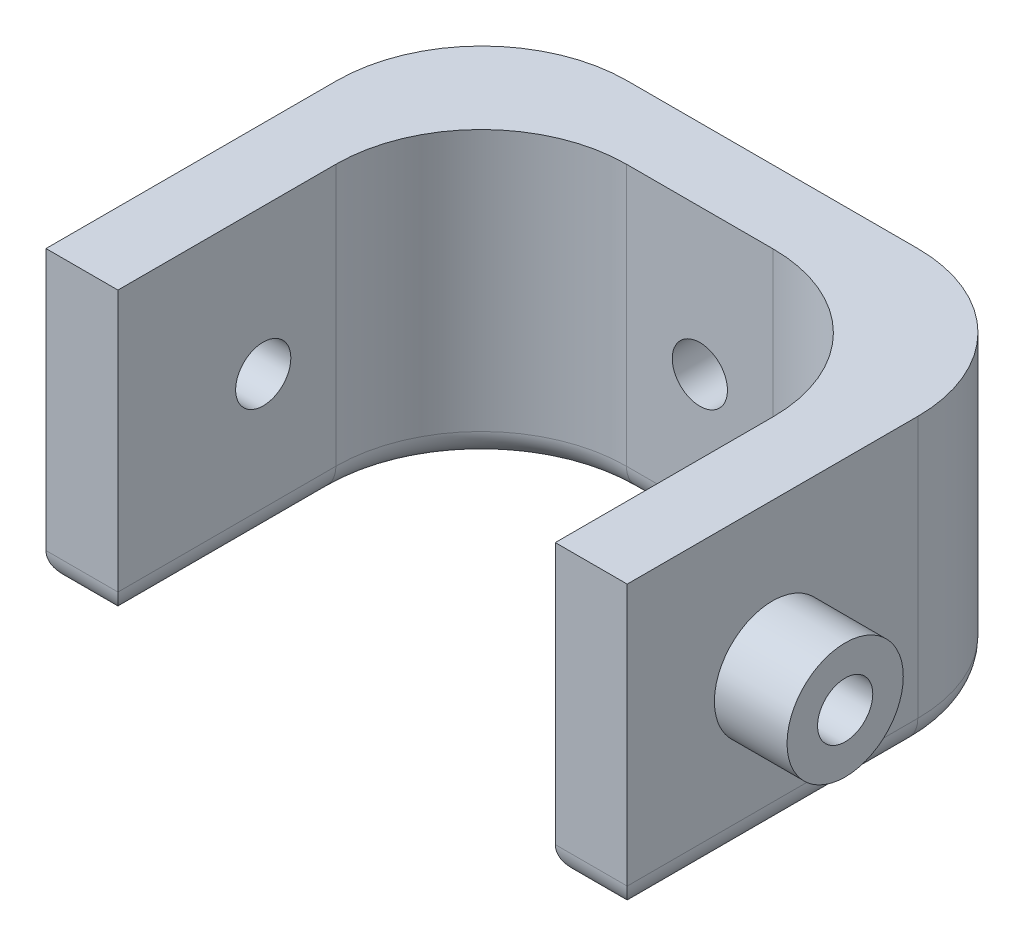
ISO-10303-21;
HEADER;
FILE_DESCRIPTION(('STEP AP214'),'2;1');
FILE_NAME('part.step','',(''),(''),'','','');
FILE_SCHEMA(('AUTOMOTIVE_DESIGN { 1 0 10303 214 1 1 1 1 }'));
ENDSEC;
DATA;
#1=APPLICATION_CONTEXT('core data for automotive mechanical design processes');
#2=APPLICATION_PROTOCOL_DEFINITION('international standard','automotive_design',2000,#1);
#3=PRODUCT_CONTEXT('',#1,'mechanical');
#4=PRODUCT('Part','Part','',(#3));
#5=PRODUCT_RELATED_PRODUCT_CATEGORY('part','',(#4));
#6=PRODUCT_DEFINITION_FORMATION('','',#4);
#7=PRODUCT_DEFINITION_CONTEXT('part definition',#1,'design');
#8=PRODUCT_DEFINITION('design','',#6,#7);
#9=PRODUCT_DEFINITION_SHAPE('','',#8);
#10=(LENGTH_UNIT() NAMED_UNIT(*) SI_UNIT(.MILLI.,.METRE.));
#11=(NAMED_UNIT(*) PLANE_ANGLE_UNIT() SI_UNIT($,.RADIAN.));
#12=(NAMED_UNIT(*) SI_UNIT($,.STERADIAN.) SOLID_ANGLE_UNIT());
#13=UNCERTAINTY_MEASURE_WITH_UNIT(LENGTH_MEASURE(1.E-05),#10,'distance_accuracy_value','');
#14=(GEOMETRIC_REPRESENTATION_CONTEXT(3) GLOBAL_UNCERTAINTY_ASSIGNED_CONTEXT((#13)) GLOBAL_UNIT_ASSIGNED_CONTEXT((#10,
#11,#12)) REPRESENTATION_CONTEXT('',''));
#15=CARTESIAN_POINT('',(0.,0.,0.));
#16=DIRECTION('',(0.,0.,1.));
#17=DIRECTION('',(1.,0.,0.));
#18=AXIS2_PLACEMENT_3D('',#15,#16,#17);
#19=CARTESIAN_POINT('',(-20.,20.,-15.));
#20=DIRECTION('',(1.,0.,0.));
#21=DIRECTION('',(0.,0.,-1.));
#22=AXIS2_PLACEMENT_3D('',#19,#20,#21);
#23=PLANE('',#22);
#24=CARTESIAN_POINT('',(-20.,10.,5.));
#25=DIRECTION('',(1.,0.,0.));
#26=DIRECTION('',(0.,0.,-1.));
#27=AXIS2_PLACEMENT_3D('',#24,#25,#26);
#28=CIRCLE('',#27,4.);
#29=CARTESIAN_POINT('',(-20.,10.,0.999999999999996));
#30=VERTEX_POINT('',#29);
#31=EDGE_CURVE('E475',#30,#30,#28,.T.);
#32=ORIENTED_EDGE('',*,*,#31,.T.);
#33=EDGE_LOOP('',(#32));
#34=FACE_BOUND('',#33,.T.);
#35=DIRECTION('',(0.,-1.,0.));
#36=VECTOR('',#35,1.);
#37=CARTESIAN_POINT('',(-20.,20.,-5.));
#38=LINE('',#37,#36);
#39=CARTESIAN_POINT('',(-20.,20.,-5.));
#40=VERTEX_POINT('',#39);
#41=CARTESIAN_POINT('',(-20.,2.,-5.));
#42=VERTEX_POINT('',#41);
#43=EDGE_CURVE('E188',#40,#42,#38,.T.);
#44=ORIENTED_EDGE('',*,*,#43,.T.);
#45=DIRECTION('',(0.,0.,1.));
#46=VECTOR('',#45,1.);
#47=CARTESIAN_POINT('',(-20.,2.,-15.));
#48=LINE('',#47,#46);
#49=CARTESIAN_POINT('',(-20.,2.,15.));
#50=VERTEX_POINT('',#49);
#51=EDGE_CURVE('E11',#42,#50,#48,.T.);
#52=ORIENTED_EDGE('',*,*,#51,.T.);
#53=DIRECTION('',(0.,-1.,0.));
#54=VECTOR('',#53,1.);
#55=CARTESIAN_POINT('',(-20.,20.,15.));
#56=LINE('',#55,#54);
#57=CARTESIAN_POINT('',(-20.,20.,15.));
#58=VERTEX_POINT('',#57);
#59=EDGE_CURVE('E180',#58,#50,#56,.T.);
#60=ORIENTED_EDGE('',*,*,#59,.F.);
#61=DIRECTION('',(0.,0.,1.));
#62=VECTOR('',#61,1.);
#63=CARTESIAN_POINT('',(-20.,20.,-15.));
#64=LINE('',#63,#62);
#65=EDGE_CURVE('E163',#40,#58,#64,.T.);
#66=ORIENTED_EDGE('',*,*,#65,.F.);
#67=EDGE_LOOP('',(#44,#52,#60,#66));
#68=FACE_BOUND('',#67,.T.);
#69=ADVANCED_FACE('F37',(#34,#68),#23,.F.);
#70=CARTESIAN_POINT('',(-20.,20.,15.));
#71=DIRECTION('',(0.,0.,-1.));
#72=DIRECTION('',(-1.,0.,0.));
#73=AXIS2_PLACEMENT_3D('',#70,#71,#72);
#74=PLANE('',#73);
#75=ORIENTED_EDGE('',*,*,#59,.T.);
#76=DIRECTION('',(1.,0.,0.));
#77=VECTOR('',#76,1.);
#78=CARTESIAN_POINT('',(-20.,2.,15.));
#79=LINE('',#78,#77);
#80=CARTESIAN_POINT('',(-15.05,2.,15.));
#81=VERTEX_POINT('',#80);
#82=EDGE_CURVE('E224',#50,#81,#79,.T.);
#83=ORIENTED_EDGE('',*,*,#82,.T.);
#84=DIRECTION('',(0.,-1.,0.));
#85=VECTOR('',#84,1.);
#86=CARTESIAN_POINT('',(-15.05,20.,15.));
#87=LINE('',#86,#85);
#88=CARTESIAN_POINT('',(-15.05,20.,15.));
#89=VERTEX_POINT('',#88);
#90=EDGE_CURVE('E183',#89,#81,#87,.T.);
#91=ORIENTED_EDGE('',*,*,#90,.F.);
#92=DIRECTION('',(1.,0.,0.));
#93=VECTOR('',#92,1.);
#94=CARTESIAN_POINT('',(-20.,20.,15.));
#95=LINE('',#94,#93);
#96=EDGE_CURVE('E168',#58,#89,#95,.T.);
#97=ORIENTED_EDGE('',*,*,#96,.F.);
#98=EDGE_LOOP('',(#75,#83,#91,#97));
#99=FACE_BOUND('',#98,.T.);
#100=ADVANCED_FACE('F178',(#99),#74,.F.);
#101=CARTESIAN_POINT('',(-15.05,20.,15.));
#102=DIRECTION('',(-1.,0.,0.));
#103=DIRECTION('',(0.,0.,1.));
#104=AXIS2_PLACEMENT_3D('',#101,#102,#103);
#105=PLANE('',#104);
#106=CARTESIAN_POINT('',(-15.05,10.,5.));
#107=DIRECTION('',(-1.,0.,0.));
#108=DIRECTION('',(0.,0.,1.));
#109=AXIS2_PLACEMENT_3D('',#106,#107,#108);
#110=CIRCLE('',#109,1.9);
#111=CARTESIAN_POINT('',(-15.05,10.,6.9));
#112=VERTEX_POINT('',#111);
#113=EDGE_CURVE('E469',#112,#112,#110,.T.);
#114=ORIENTED_EDGE('',*,*,#113,.T.);
#115=EDGE_LOOP('',(#114));
#116=FACE_BOUND('',#115,.T.);
#117=ORIENTED_EDGE('',*,*,#90,.T.);
#118=DIRECTION('',(0.,0.,-1.));
#119=VECTOR('',#118,1.);
#120=CARTESIAN_POINT('',(-15.05,2.,15.));
#121=LINE('',#120,#119);
#122=CARTESIAN_POINT('',(-15.05,2.,0.));
#123=VERTEX_POINT('',#122);
#124=EDGE_CURVE('E255',#81,#123,#121,.T.);
#125=ORIENTED_EDGE('',*,*,#124,.T.);
#126=DIRECTION('',(0.,-1.,0.));
#127=VECTOR('',#126,1.);
#128=CARTESIAN_POINT('',(-15.05,20.,0.));
#129=LINE('',#128,#127);
#130=CARTESIAN_POINT('',(-15.05,20.,0.));
#131=VERTEX_POINT('',#130);
#132=EDGE_CURVE('E212',#123,#131,#129,.F.);
#133=ORIENTED_EDGE('',*,*,#132,.T.);
#134=DIRECTION('',(0.,0.,-1.));
#135=VECTOR('',#134,1.);
#136=CARTESIAN_POINT('',(-15.05,20.,15.));
#137=LINE('',#136,#135);
#138=EDGE_CURVE('E185',#89,#131,#137,.T.);
#139=ORIENTED_EDGE('',*,*,#138,.F.);
#140=EDGE_LOOP('',(#117,#125,#133,#139));
#141=FACE_BOUND('',#140,.T.);
#142=ADVANCED_FACE('F342',(#116,#141),#105,.F.);
#143=CARTESIAN_POINT('',(-15.05,20.,-10.));
#144=DIRECTION('',(0.,0.,-1.));
#145=DIRECTION('',(-1.,0.,0.));
#146=AXIS2_PLACEMENT_3D('',#143,#144,#145);
#147=PLANE('',#146);
#148=CARTESIAN_POINT('',(0.,10.,-10.));
#149=DIRECTION('',(0.,0.,-1.));
#150=DIRECTION('',(-1.,0.,0.));
#151=AXIS2_PLACEMENT_3D('',#148,#149,#150);
#152=CIRCLE('',#151,1.9);
#153=CARTESIAN_POINT('',(-1.9,10.,-10.));
#154=VERTEX_POINT('',#153);
#155=EDGE_CURVE('E225',#154,#154,#152,.T.);
#156=ORIENTED_EDGE('',*,*,#155,.T.);
#157=EDGE_LOOP('',(#156));
#158=FACE_BOUND('',#157,.T.);
#159=DIRECTION('',(0.,-1.,0.));
#160=VECTOR('',#159,1.);
#161=CARTESIAN_POINT('',(-5.05,0.,-10.));
#162=LINE('',#161,#160);
#163=CARTESIAN_POINT('',(-5.05,20.,-10.));
#164=VERTEX_POINT('',#163);
#165=CARTESIAN_POINT('',(-5.05,2.,-10.));
#166=VERTEX_POINT('',#165);
#167=EDGE_CURVE('E207',#164,#166,#162,.T.);
#168=ORIENTED_EDGE('',*,*,#167,.T.);
#169=DIRECTION('',(1.,0.,0.));
#170=VECTOR('',#169,1.);
#171=CARTESIAN_POINT('',(-15.05,2.,-10.));
#172=LINE('',#171,#170);
#173=CARTESIAN_POINT('',(5.05000000000001,2.,-10.));
#174=VERTEX_POINT('',#173);
#175=EDGE_CURVE('E259',#166,#174,#172,.T.);
#176=ORIENTED_EDGE('',*,*,#175,.T.);
#177=DIRECTION('',(0.,-1.,0.));
#178=VECTOR('',#177,1.);
#179=CARTESIAN_POINT('',(5.05000000000001,20.,-10.));
#180=LINE('',#179,#178);
#181=CARTESIAN_POINT('',(5.05000000000001,20.,-10.));
#182=VERTEX_POINT('',#181);
#183=EDGE_CURVE('E210',#174,#182,#180,.F.);
#184=ORIENTED_EDGE('',*,*,#183,.T.);
#185=DIRECTION('',(1.,0.,0.));
#186=VECTOR('',#185,1.);
#187=CARTESIAN_POINT('',(-15.05,20.,-10.));
#188=LINE('',#187,#186);
#189=EDGE_CURVE('E345',#164,#182,#188,.T.);
#190=ORIENTED_EDGE('',*,*,#189,.F.);
#191=EDGE_LOOP('',(#168,#176,#184,#190));
#192=FACE_BOUND('',#191,.T.);
#193=ADVANCED_FACE('F433',(#158,#192),#147,.F.);
#194=CARTESIAN_POINT('',(15.05,20.,15.));
#195=DIRECTION('',(1.,0.,0.));
#196=DIRECTION('',(0.,0.,-1.));
#197=AXIS2_PLACEMENT_3D('',#194,#195,#196);
#198=PLANE('',#197);
#199=CARTESIAN_POINT('',(15.05,10.,5.));
#200=DIRECTION('',(1.,0.,0.));
#201=DIRECTION('',(0.,0.,-1.));
#202=AXIS2_PLACEMENT_3D('',#199,#200,#201);
#203=CIRCLE('',#202,1.9);
#204=CARTESIAN_POINT('',(15.05,10.,3.1));
#205=VERTEX_POINT('',#204);
#206=EDGE_CURVE('E472',#205,#205,#203,.T.);
#207=ORIENTED_EDGE('',*,*,#206,.T.);
#208=EDGE_LOOP('',(#207));
#209=FACE_BOUND('',#208,.T.);
#210=DIRECTION('',(0.,-1.,0.));
#211=VECTOR('',#210,1.);
#212=CARTESIAN_POINT('',(15.05,0.,0.));
#213=LINE('',#212,#211);
#214=CARTESIAN_POINT('',(15.05,20.,0.));
#215=VERTEX_POINT('',#214);
#216=CARTESIAN_POINT('',(15.05,2.,0.));
#217=VERTEX_POINT('',#216);
#218=EDGE_CURVE('E204',#215,#217,#213,.T.);
#219=ORIENTED_EDGE('',*,*,#218,.T.);
#220=DIRECTION('',(0.,0.,1.));
#221=VECTOR('',#220,1.);
#222=CARTESIAN_POINT('',(15.05,2.,15.));
#223=LINE('',#222,#221);
#224=CARTESIAN_POINT('',(15.05,2.,15.));
#225=VERTEX_POINT('',#224);
#226=EDGE_CURVE('E263',#217,#225,#223,.T.);
#227=ORIENTED_EDGE('',*,*,#226,.T.);
#228=DIRECTION('',(0.,-1.,0.));
#229=VECTOR('',#228,1.);
#230=CARTESIAN_POINT('',(15.05,20.,15.));
#231=LINE('',#230,#229);
#232=CARTESIAN_POINT('',(15.05,20.,15.));
#233=VERTEX_POINT('',#232);
#234=EDGE_CURVE('E192',#233,#225,#231,.T.);
#235=ORIENTED_EDGE('',*,*,#234,.F.);
#236=DIRECTION('',(0.,0.,1.));
#237=VECTOR('',#236,1.);
#238=CARTESIAN_POINT('',(15.05,20.,15.));
#239=LINE('',#238,#237);
#240=EDGE_CURVE('E348',#215,#233,#239,.T.);
#241=ORIENTED_EDGE('',*,*,#240,.F.);
#242=EDGE_LOOP('',(#219,#227,#235,#241));
#243=FACE_BOUND('',#242,.T.);
#244=ADVANCED_FACE('F369',(#209,#243),#198,.F.);
#245=CARTESIAN_POINT('',(15.05,20.,15.));
#246=DIRECTION('',(0.,0.,-1.));
#247=DIRECTION('',(-1.,0.,0.));
#248=AXIS2_PLACEMENT_3D('',#245,#246,#247);
#249=PLANE('',#248);
#250=ORIENTED_EDGE('',*,*,#234,.T.);
#251=DIRECTION('',(1.,0.,0.));
#252=VECTOR('',#251,1.);
#253=CARTESIAN_POINT('',(15.05,2.,15.));
#254=LINE('',#253,#252);
#255=CARTESIAN_POINT('',(20.,2.,15.));
#256=VERTEX_POINT('',#255);
#257=EDGE_CURVE('E265',#225,#256,#254,.T.);
#258=ORIENTED_EDGE('',*,*,#257,.T.);
#259=DIRECTION('',(0.,-1.,0.));
#260=VECTOR('',#259,1.);
#261=CARTESIAN_POINT('',(20.,20.,15.));
#262=LINE('',#261,#260);
#263=CARTESIAN_POINT('',(20.,20.,15.));
#264=VERTEX_POINT('',#263);
#265=EDGE_CURVE('E359',#264,#256,#262,.T.);
#266=ORIENTED_EDGE('',*,*,#265,.F.);
#267=DIRECTION('',(1.,0.,0.));
#268=VECTOR('',#267,1.);
#269=CARTESIAN_POINT('',(15.05,20.,15.));
#270=LINE('',#269,#268);
#271=EDGE_CURVE('E352',#233,#264,#270,.T.);
#272=ORIENTED_EDGE('',*,*,#271,.F.);
#273=EDGE_LOOP('',(#250,#258,#266,#272));
#274=FACE_BOUND('',#273,.T.);
#275=ADVANCED_FACE('F365',(#274),#249,.F.);
#276=CARTESIAN_POINT('',(20.,20.,-15.));
#277=DIRECTION('',(-1.,0.,0.));
#278=DIRECTION('',(0.,0.,1.));
#279=AXIS2_PLACEMENT_3D('',#276,#277,#278);
#280=PLANE('',#279);
#281=CARTESIAN_POINT('',(20.,10.,5.));
#282=DIRECTION('',(-1.,0.,0.));
#283=DIRECTION('',(0.,0.,1.));
#284=AXIS2_PLACEMENT_3D('',#281,#282,#283);
#285=CIRCLE('',#284,4.);
#286=CARTESIAN_POINT('',(20.,10.,9.));
#287=VERTEX_POINT('',#286);
#288=EDGE_CURVE('E218',#287,#287,#285,.F.);
#289=ORIENTED_EDGE('',*,*,#288,.F.);
#290=EDGE_LOOP('',(#289));
#291=FACE_BOUND('',#290,.T.);
#292=ORIENTED_EDGE('',*,*,#265,.T.);
#293=DIRECTION('',(0.,0.,-1.));
#294=VECTOR('',#293,1.);
#295=CARTESIAN_POINT('',(20.,2.,-15.));
#296=LINE('',#295,#294);
#297=CARTESIAN_POINT('',(20.,2.,-5.));
#298=VERTEX_POINT('',#297);
#299=EDGE_CURVE('E267',#256,#298,#296,.T.);
#300=ORIENTED_EDGE('',*,*,#299,.T.);
#301=DIRECTION('',(0.,-1.,0.));
#302=VECTOR('',#301,1.);
#303=CARTESIAN_POINT('',(20.,20.,-5.));
#304=LINE('',#303,#302);
#305=CARTESIAN_POINT('',(20.,20.,-5.));
#306=VERTEX_POINT('',#305);
#307=EDGE_CURVE('E202',#298,#306,#304,.F.);
#308=ORIENTED_EDGE('',*,*,#307,.T.);
#309=DIRECTION('',(0.,0.,-1.));
#310=VECTOR('',#309,1.);
#311=CARTESIAN_POINT('',(20.,20.,-15.));
#312=LINE('',#311,#310);
#313=EDGE_CURVE('E354',#264,#306,#312,.T.);
#314=ORIENTED_EDGE('',*,*,#313,.F.);
#315=EDGE_LOOP('',(#292,#300,#308,#314));
#316=FACE_BOUND('',#315,.T.);
#317=ADVANCED_FACE('F438',(#291,#316),#280,.F.);
#318=CARTESIAN_POINT('',(-20.,20.,-15.));
#319=DIRECTION('',(0.,0.,1.));
#320=DIRECTION('',(1.,0.,0.));
#321=AXIS2_PLACEMENT_3D('',#318,#319,#320);
#322=PLANE('',#321);
#323=CARTESIAN_POINT('',(0.,10.,-15.));
#324=DIRECTION('',(0.,0.,1.));
#325=DIRECTION('',(1.,0.,0.));
#326=AXIS2_PLACEMENT_3D('',#323,#324,#325);
#327=CIRCLE('',#326,4.);
#328=CARTESIAN_POINT('',(4.,10.,-15.));
#329=VERTEX_POINT('',#328);
#330=EDGE_CURVE('E221',#329,#329,#327,.F.);
#331=ORIENTED_EDGE('',*,*,#330,.F.);
#332=EDGE_LOOP('',(#331));
#333=FACE_BOUND('',#332,.T.);
#334=DIRECTION('',(0.,-1.,0.));
#335=VECTOR('',#334,1.);
#336=CARTESIAN_POINT('',(10.,20.,-15.));
#337=LINE('',#336,#335);
#338=CARTESIAN_POINT('',(10.,20.,-15.));
#339=VERTEX_POINT('',#338);
#340=CARTESIAN_POINT('',(10.,2.,-15.));
#341=VERTEX_POINT('',#340);
#342=EDGE_CURVE('E190',#339,#341,#337,.T.);
#343=ORIENTED_EDGE('',*,*,#342,.T.);
#344=DIRECTION('',(-1.,0.,0.));
#345=VECTOR('',#344,1.);
#346=CARTESIAN_POINT('',(-20.,2.,-15.));
#347=LINE('',#346,#345);
#348=CARTESIAN_POINT('',(-10.,2.,-15.));
#349=VERTEX_POINT('',#348);
#350=EDGE_CURVE('E61',#341,#349,#347,.T.);
#351=ORIENTED_EDGE('',*,*,#350,.T.);
#352=DIRECTION('',(0.,-1.,0.));
#353=VECTOR('',#352,1.);
#354=CARTESIAN_POINT('',(-10.,20.,-15.));
#355=LINE('',#354,#353);
#356=CARTESIAN_POINT('',(-10.,20.,-15.));
#357=VERTEX_POINT('',#356);
#358=EDGE_CURVE('E197',#349,#357,#355,.F.);
#359=ORIENTED_EDGE('',*,*,#358,.T.);
#360=DIRECTION('',(-1.,0.,0.));
#361=VECTOR('',#360,1.);
#362=CARTESIAN_POINT('',(-20.,20.,-15.));
#363=LINE('',#362,#361);
#364=EDGE_CURVE('E357',#339,#357,#363,.T.);
#365=ORIENTED_EDGE('',*,*,#364,.F.);
#366=EDGE_LOOP('',(#343,#351,#359,#365));
#367=FACE_BOUND('',#366,.T.);
#368=ADVANCED_FACE('F442',(#333,#367),#322,.F.);
#369=CARTESIAN_POINT('',(0.,20.,0.));
#370=DIRECTION('',(0.,1.,0.));
#371=DIRECTION('',(0.,0.,1.));
#372=AXIS2_PLACEMENT_3D('',#369,#370,#371);
#373=PLANE('',#372);
#374=ORIENTED_EDGE('',*,*,#364,.T.);
#375=CARTESIAN_POINT('',(-9.99999999999999,20.,-5.));
#376=DIRECTION('',(0.,1.,0.));
#377=DIRECTION('',(0.,0.,1.));
#378=AXIS2_PLACEMENT_3D('',#375,#376,#377);
#379=CIRCLE('',#378,10.);
#380=EDGE_CURVE('E171',#357,#40,#379,.T.);
#381=ORIENTED_EDGE('',*,*,#380,.T.);
#382=ORIENTED_EDGE('',*,*,#65,.T.);
#383=ORIENTED_EDGE('',*,*,#96,.T.);
#384=ORIENTED_EDGE('',*,*,#138,.T.);
#385=CARTESIAN_POINT('',(-5.05,20.,0.));
#386=DIRECTION('',(0.,1.,0.));
#387=DIRECTION('',(0.,0.,1.));
#388=AXIS2_PLACEMENT_3D('',#385,#386,#387);
#389=CIRCLE('',#388,10.);
#390=EDGE_CURVE('E216',#131,#164,#389,.F.);
#391=ORIENTED_EDGE('',*,*,#390,.T.);
#392=ORIENTED_EDGE('',*,*,#189,.T.);
#393=CARTESIAN_POINT('',(5.05000000000001,20.,0.));
#394=DIRECTION('',(0.,1.,0.));
#395=DIRECTION('',(0.,0.,1.));
#396=AXIS2_PLACEMENT_3D('',#393,#394,#395);
#397=CIRCLE('',#396,10.);
#398=EDGE_CURVE('E214',#182,#215,#397,.F.);
#399=ORIENTED_EDGE('',*,*,#398,.T.);
#400=ORIENTED_EDGE('',*,*,#240,.T.);
#401=ORIENTED_EDGE('',*,*,#271,.T.);
#402=ORIENTED_EDGE('',*,*,#313,.T.);
#403=CARTESIAN_POINT('',(10.,20.,-5.));
#404=DIRECTION('',(0.,1.,0.));
#405=DIRECTION('',(0.,0.,1.));
#406=AXIS2_PLACEMENT_3D('',#403,#404,#405);
#407=CIRCLE('',#406,10.);
#408=EDGE_CURVE('E199',#306,#339,#407,.T.);
#409=ORIENTED_EDGE('',*,*,#408,.T.);
#410=EDGE_LOOP('',(#374,#381,#382,#383,#384,#391,#392,#399,#400,#401,#402,#409));
#411=FACE_BOUND('',#410,.T.);
#412=ADVANCED_FACE('F166',(#411),#373,.T.);
#413=CARTESIAN_POINT('',(0.,0.,0.));
#414=DIRECTION('',(0.,1.,0.));
#415=DIRECTION('',(0.,0.,1.));
#416=AXIS2_PLACEMENT_3D('',#413,#414,#415);
#417=PLANE('',#416);
#418=DIRECTION('',(0.,0.,-1.));
#419=VECTOR('',#418,1.);
#420=CARTESIAN_POINT('',(-17.05,0.,0.));
#421=LINE('',#420,#419);
#422=CARTESIAN_POINT('',(-17.05,0.,0.));
#423=VERTEX_POINT('',#422);
#424=CARTESIAN_POINT('',(-17.05,0.,13.));
#425=VERTEX_POINT('',#424);
#426=EDGE_CURVE('E250',#423,#425,#421,.F.);
#427=ORIENTED_EDGE('',*,*,#426,.T.);
#428=DIRECTION('',(1.,0.,0.));
#429=VECTOR('',#428,1.);
#430=CARTESIAN_POINT('',(0.,0.,13.));
#431=LINE('',#430,#429);
#432=CARTESIAN_POINT('',(-18.,0.,13.));
#433=VERTEX_POINT('',#432);
#434=EDGE_CURVE('E252',#425,#433,#431,.F.);
#435=ORIENTED_EDGE('',*,*,#434,.T.);
#436=DIRECTION('',(0.,0.,1.));
#437=VECTOR('',#436,1.);
#438=CARTESIAN_POINT('',(-18.,0.,0.));
#439=LINE('',#438,#437);
#440=CARTESIAN_POINT('',(-18.,0.,-5.));
#441=VERTEX_POINT('',#440);
#442=EDGE_CURVE('E230',#433,#441,#439,.F.);
#443=ORIENTED_EDGE('',*,*,#442,.T.);
#444=CARTESIAN_POINT('',(-9.99999999999999,0.,-5.));
#445=DIRECTION('',(0.,1.,0.));
#446=DIRECTION('',(0.,0.,1.));
#447=AXIS2_PLACEMENT_3D('',#444,#445,#446);
#448=CIRCLE('',#447,8.);
#449=CARTESIAN_POINT('',(-10.,0.,-13.));
#450=VERTEX_POINT('',#449);
#451=EDGE_CURVE('E232',#441,#450,#448,.F.);
#452=ORIENTED_EDGE('',*,*,#451,.T.);
#453=DIRECTION('',(-1.,0.,0.));
#454=VECTOR('',#453,1.);
#455=CARTESIAN_POINT('',(0.,0.,-13.));
#456=LINE('',#455,#454);
#457=CARTESIAN_POINT('',(10.,0.,-13.));
#458=VERTEX_POINT('',#457);
#459=EDGE_CURVE('E234',#450,#458,#456,.F.);
#460=ORIENTED_EDGE('',*,*,#459,.T.);
#461=CARTESIAN_POINT('',(10.,0.,-5.));
#462=DIRECTION('',(0.,1.,0.));
#463=DIRECTION('',(0.,0.,1.));
#464=AXIS2_PLACEMENT_3D('',#461,#462,#463);
#465=CIRCLE('',#464,8.);
#466=CARTESIAN_POINT('',(18.,0.,-5.));
#467=VERTEX_POINT('',#466);
#468=EDGE_CURVE('E236',#458,#467,#465,.F.);
#469=ORIENTED_EDGE('',*,*,#468,.T.);
#470=DIRECTION('',(0.,0.,-1.));
#471=VECTOR('',#470,1.);
#472=CARTESIAN_POINT('',(18.,0.,0.));
#473=LINE('',#472,#471);
#474=CARTESIAN_POINT('',(18.,0.,13.));
#475=VERTEX_POINT('',#474);
#476=EDGE_CURVE('E238',#467,#475,#473,.F.);
#477=ORIENTED_EDGE('',*,*,#476,.T.);
#478=DIRECTION('',(1.,0.,0.));
#479=VECTOR('',#478,1.);
#480=CARTESIAN_POINT('',(0.,0.,13.));
#481=LINE('',#480,#479);
#482=CARTESIAN_POINT('',(17.05,0.,13.));
#483=VERTEX_POINT('',#482);
#484=EDGE_CURVE('E240',#475,#483,#481,.F.);
#485=ORIENTED_EDGE('',*,*,#484,.T.);
#486=DIRECTION('',(0.,0.,1.));
#487=VECTOR('',#486,1.);
#488=CARTESIAN_POINT('',(17.05,0.,0.));
#489=LINE('',#488,#487);
#490=CARTESIAN_POINT('',(17.05,0.,0.));
#491=VERTEX_POINT('',#490);
#492=EDGE_CURVE('E242',#483,#491,#489,.F.);
#493=ORIENTED_EDGE('',*,*,#492,.T.);
#494=CARTESIAN_POINT('',(5.05000000000001,0.,0.));
#495=DIRECTION('',(0.,1.,0.));
#496=DIRECTION('',(0.,0.,1.));
#497=AXIS2_PLACEMENT_3D('',#494,#495,#496);
#498=CIRCLE('',#497,12.);
#499=CARTESIAN_POINT('',(5.05000000000001,0.,-12.));
#500=VERTEX_POINT('',#499);
#501=EDGE_CURVE('E244',#491,#500,#498,.T.);
#502=ORIENTED_EDGE('',*,*,#501,.T.);
#503=DIRECTION('',(1.,0.,0.));
#504=VECTOR('',#503,1.);
#505=CARTESIAN_POINT('',(0.,0.,-12.));
#506=LINE('',#505,#504);
#507=CARTESIAN_POINT('',(-5.05,0.,-12.));
#508=VERTEX_POINT('',#507);
#509=EDGE_CURVE('E246',#500,#508,#506,.F.);
#510=ORIENTED_EDGE('',*,*,#509,.T.);
#511=CARTESIAN_POINT('',(-5.05,0.,0.));
#512=DIRECTION('',(0.,1.,0.));
#513=DIRECTION('',(0.,0.,1.));
#514=AXIS2_PLACEMENT_3D('',#511,#512,#513);
#515=CIRCLE('',#514,12.);
#516=EDGE_CURVE('E248',#508,#423,#515,.T.);
#517=ORIENTED_EDGE('',*,*,#516,.T.);
#518=EDGE_LOOP('',(#427,#435,#443,#452,#460,#469,#477,#485,#493,#502,#510,#517));
#519=FACE_BOUND('',#518,.T.);
#520=ADVANCED_FACE('F317',(#519),#417,.F.);
#521=CARTESIAN_POINT('',(-9.99999999999999,20.,-5.));
#522=DIRECTION('',(0.,-1.,0.));
#523=DIRECTION('',(0.,0.,-1.));
#524=AXIS2_PLACEMENT_3D('',#521,#522,#523);
#525=CYLINDRICAL_SURFACE('',#524,10.);
#526=ORIENTED_EDGE('',*,*,#358,.F.);
#527=CARTESIAN_POINT('',(-9.99999999999999,2.,-5.));
#528=DIRECTION('',(0.,1.,0.));
#529=DIRECTION('',(0.,0.,1.));
#530=AXIS2_PLACEMENT_3D('',#527,#528,#529);
#531=CIRCLE('',#530,10.);
#532=EDGE_CURVE('E46',#349,#42,#531,.T.);
#533=ORIENTED_EDGE('',*,*,#532,.T.);
#534=ORIENTED_EDGE('',*,*,#43,.F.);
#535=ORIENTED_EDGE('',*,*,#380,.F.);
#536=EDGE_LOOP('',(#526,#533,#534,#535));
#537=FACE_BOUND('',#536,.T.);
#538=ADVANCED_FACE('F408',(#537),#525,.T.);
#539=CARTESIAN_POINT('',(10.,20.,-5.));
#540=DIRECTION('',(0.,-1.,0.));
#541=DIRECTION('',(0.,0.,-1.));
#542=AXIS2_PLACEMENT_3D('',#539,#540,#541);
#543=CYLINDRICAL_SURFACE('',#542,10.);
#544=ORIENTED_EDGE('',*,*,#307,.F.);
#545=CARTESIAN_POINT('',(10.,2.,-5.));
#546=DIRECTION('',(0.,1.,0.));
#547=DIRECTION('',(0.,0.,1.));
#548=AXIS2_PLACEMENT_3D('',#545,#546,#547);
#549=CIRCLE('',#548,10.);
#550=EDGE_CURVE('E269',#298,#341,#549,.T.);
#551=ORIENTED_EDGE('',*,*,#550,.T.);
#552=ORIENTED_EDGE('',*,*,#342,.F.);
#553=ORIENTED_EDGE('',*,*,#408,.F.);
#554=EDGE_LOOP('',(#544,#551,#552,#553));
#555=FACE_BOUND('',#554,.T.);
#556=ADVANCED_FACE('F411',(#555),#543,.T.);
#557=CARTESIAN_POINT('',(5.05000000000001,20.,0.));
#558=DIRECTION('',(0.,1.,0.));
#559=DIRECTION('',(0.,0.,1.));
#560=AXIS2_PLACEMENT_3D('',#557,#558,#559);
#561=CYLINDRICAL_SURFACE('',#560,10.);
#562=ORIENTED_EDGE('',*,*,#183,.F.);
#563=CARTESIAN_POINT('',(5.05000000000001,2.,0.));
#564=DIRECTION('',(0.,1.,0.));
#565=DIRECTION('',(0.,0.,1.));
#566=AXIS2_PLACEMENT_3D('',#563,#564,#565);
#567=CIRCLE('',#566,10.);
#568=EDGE_CURVE('E261',#174,#217,#567,.F.);
#569=ORIENTED_EDGE('',*,*,#568,.T.);
#570=ORIENTED_EDGE('',*,*,#218,.F.);
#571=ORIENTED_EDGE('',*,*,#398,.F.);
#572=EDGE_LOOP('',(#562,#569,#570,#571));
#573=FACE_BOUND('',#572,.T.);
#574=ADVANCED_FACE('F414',(#573),#561,.F.);
#575=CARTESIAN_POINT('',(-5.05,20.,0.));
#576=DIRECTION('',(0.,1.,0.));
#577=DIRECTION('',(0.,0.,1.));
#578=AXIS2_PLACEMENT_3D('',#575,#576,#577);
#579=CYLINDRICAL_SURFACE('',#578,10.);
#580=ORIENTED_EDGE('',*,*,#132,.F.);
#581=CARTESIAN_POINT('',(-5.05,2.,0.));
#582=DIRECTION('',(0.,1.,0.));
#583=DIRECTION('',(0.,0.,1.));
#584=AXIS2_PLACEMENT_3D('',#581,#582,#583);
#585=CIRCLE('',#584,10.);
#586=EDGE_CURVE('E257',#123,#166,#585,.F.);
#587=ORIENTED_EDGE('',*,*,#586,.T.);
#588=ORIENTED_EDGE('',*,*,#167,.F.);
#589=ORIENTED_EDGE('',*,*,#390,.F.);
#590=EDGE_LOOP('',(#580,#587,#588,#589));
#591=FACE_BOUND('',#590,.T.);
#592=ADVANCED_FACE('F418',(#591),#579,.F.);
#593=CARTESIAN_POINT('',(25.,10.,4.99999999999999));
#594=DIRECTION('',(1.,0.,0.));
#595=DIRECTION('',(0.,0.,-1.));
#596=AXIS2_PLACEMENT_3D('',#593,#594,#595);
#597=PLANE('',#596);
#598=CARTESIAN_POINT('',(25.,10.,4.99999999999999));
#599=DIRECTION('',(1.,0.,0.));
#600=DIRECTION('',(0.,0.,-1.));
#601=AXIS2_PLACEMENT_3D('',#598,#599,#600);
#602=CIRCLE('',#601,4.);
#603=CARTESIAN_POINT('',(25.,10.,0.999999999999995));
#604=VERTEX_POINT('',#603);
#605=EDGE_CURVE('E174',#604,#604,#602,.T.);
#606=ORIENTED_EDGE('',*,*,#605,.T.);
#607=EDGE_LOOP('',(#606));
#608=FACE_BOUND('',#607,.T.);
#609=CARTESIAN_POINT('',(25.,10.,4.99999999999999));
#610=DIRECTION('',(1.,0.,0.));
#611=DIRECTION('',(0.,0.,-1.));
#612=AXIS2_PLACEMENT_3D('',#609,#610,#611);
#613=CIRCLE('',#612,1.9);
#614=CARTESIAN_POINT('',(25.,10.,3.09999999999999));
#615=VERTEX_POINT('',#614);
#616=EDGE_CURVE('E485',#615,#615,#613,.T.);
#617=ORIENTED_EDGE('',*,*,#616,.F.);
#618=EDGE_LOOP('',(#617));
#619=FACE_BOUND('',#618,.T.);
#620=ADVANCED_FACE('F421',(#608,#619),#597,.T.);
#621=CARTESIAN_POINT('',(25.,10.,4.99999999999999));
#622=DIRECTION('',(-1.,0.,0.));
#623=DIRECTION('',(0.,0.,1.));
#624=AXIS2_PLACEMENT_3D('',#621,#622,#623);
#625=CYLINDRICAL_SURFACE('',#624,4.);
#626=ORIENTED_EDGE('',*,*,#605,.F.);
#627=EDGE_LOOP('',(#626));
#628=FACE_BOUND('',#627,.T.);
#629=ORIENTED_EDGE('',*,*,#288,.T.);
#630=EDGE_LOOP('',(#629));
#631=FACE_BOUND('',#630,.T.);
#632=ADVANCED_FACE('F426',(#628,#631),#625,.T.);
#633=CARTESIAN_POINT('',(25.,10.,4.99999999999999));
#634=DIRECTION('',(-1.,0.,0.));
#635=DIRECTION('',(0.,0.,1.));
#636=AXIS2_PLACEMENT_3D('',#633,#634,#635);
#637=CYLINDRICAL_SURFACE('',#636,1.9);
#638=ORIENTED_EDGE('',*,*,#616,.T.);
#639=EDGE_LOOP('',(#638));
#640=FACE_BOUND('',#639,.T.);
#641=ORIENTED_EDGE('',*,*,#206,.F.);
#642=EDGE_LOOP('',(#641));
#643=FACE_BOUND('',#642,.T.);
#644=ADVANCED_FACE('F495',(#640,#643),#637,.F.);
#645=CARTESIAN_POINT('',(-25.,10.,4.99999999999999));
#646=DIRECTION('',(1.,0.,0.));
#647=DIRECTION('',(0.,0.,-1.));
#648=AXIS2_PLACEMENT_3D('',#645,#646,#647);
#649=CYLINDRICAL_SURFACE('',#648,4.);
#650=CARTESIAN_POINT('',(-25.,10.,4.99999999999999));
#651=DIRECTION('',(1.,0.,0.));
#652=DIRECTION('',(0.,0.,-1.));
#653=AXIS2_PLACEMENT_3D('',#650,#651,#652);
#654=CIRCLE('',#653,4.);
#655=CARTESIAN_POINT('',(-25.,10.,0.999999999999995));
#656=VERTEX_POINT('',#655);
#657=EDGE_CURVE('E482',#656,#656,#654,.T.);
#658=ORIENTED_EDGE('',*,*,#657,.T.);
#659=EDGE_LOOP('',(#658));
#660=FACE_BOUND('',#659,.T.);
#661=ORIENTED_EDGE('',*,*,#31,.F.);
#662=EDGE_LOOP('',(#661));
#663=FACE_BOUND('',#662,.T.);
#664=ADVANCED_FACE('F501',(#660,#663),#649,.T.);
#665=CARTESIAN_POINT('',(-25.,10.,4.99999999999999));
#666=DIRECTION('',(-1.,0.,0.));
#667=DIRECTION('',(0.,0.,-1.));
#668=AXIS2_PLACEMENT_3D('',#665,#666,#667);
#669=PLANE('',#668);
#670=CARTESIAN_POINT('',(-25.,10.,4.99999999999999));
#671=DIRECTION('',(1.,0.,0.));
#672=DIRECTION('',(0.,0.,-1.));
#673=AXIS2_PLACEMENT_3D('',#670,#671,#672);
#674=CIRCLE('',#673,1.9);
#675=CARTESIAN_POINT('',(-25.,10.,3.09999999999999));
#676=VERTEX_POINT('',#675);
#677=EDGE_CURVE('E471',#676,#676,#674,.T.);
#678=ORIENTED_EDGE('',*,*,#677,.T.);
#679=EDGE_LOOP('',(#678));
#680=FACE_BOUND('',#679,.T.);
#681=ORIENTED_EDGE('',*,*,#657,.F.);
#682=EDGE_LOOP('',(#681));
#683=FACE_BOUND('',#682,.T.);
#684=ADVANCED_FACE('F507',(#680,#683),#669,.T.);
#685=CARTESIAN_POINT('',(-25.,10.,4.99999999999999));
#686=DIRECTION('',(1.,0.,0.));
#687=DIRECTION('',(0.,0.,-1.));
#688=AXIS2_PLACEMENT_3D('',#685,#686,#687);
#689=CYLINDRICAL_SURFACE('',#688,1.9);
#690=ORIENTED_EDGE('',*,*,#677,.F.);
#691=EDGE_LOOP('',(#690));
#692=FACE_BOUND('',#691,.T.);
#693=ORIENTED_EDGE('',*,*,#113,.F.);
#694=EDGE_LOOP('',(#693));
#695=FACE_BOUND('',#694,.T.);
#696=ADVANCED_FACE('F511',(#692,#695),#689,.F.);
#697=CARTESIAN_POINT('',(0.,10.,-20.));
#698=DIRECTION('',(0.,0.,-1.));
#699=DIRECTION('',(-1.,0.,0.));
#700=AXIS2_PLACEMENT_3D('',#697,#698,#699);
#701=PLANE('',#700);
#702=CARTESIAN_POINT('',(0.,10.,-20.));
#703=DIRECTION('',(0.,0.,-1.));
#704=DIRECTION('',(-1.,0.,0.));
#705=AXIS2_PLACEMENT_3D('',#702,#703,#704);
#706=CIRCLE('',#705,4.);
#707=CARTESIAN_POINT('',(-4.,10.,-20.));
#708=VERTEX_POINT('',#707);
#709=EDGE_CURVE('E478',#708,#708,#706,.T.);
#710=ORIENTED_EDGE('',*,*,#709,.T.);
#711=EDGE_LOOP('',(#710));
#712=FACE_BOUND('',#711,.T.);
#713=CARTESIAN_POINT('',(0.,10.,-20.));
#714=DIRECTION('',(0.,0.,-1.));
#715=DIRECTION('',(-1.,0.,0.));
#716=AXIS2_PLACEMENT_3D('',#713,#714,#715);
#717=CIRCLE('',#716,1.9);
#718=CARTESIAN_POINT('',(-1.9,10.,-20.));
#719=VERTEX_POINT('',#718);
#720=EDGE_CURVE('E228',#719,#719,#717,.T.);
#721=ORIENTED_EDGE('',*,*,#720,.F.);
#722=EDGE_LOOP('',(#721));
#723=FACE_BOUND('',#722,.T.);
#724=ADVANCED_FACE('F515',(#712,#723),#701,.T.);
#725=CARTESIAN_POINT('',(0.,10.,-20.));
#726=DIRECTION('',(0.,0.,1.));
#727=DIRECTION('',(1.,0.,0.));
#728=AXIS2_PLACEMENT_3D('',#725,#726,#727);
#729=CYLINDRICAL_SURFACE('',#728,4.);
#730=ORIENTED_EDGE('',*,*,#709,.F.);
#731=EDGE_LOOP('',(#730));
#732=FACE_BOUND('',#731,.T.);
#733=ORIENTED_EDGE('',*,*,#330,.T.);
#734=EDGE_LOOP('',(#733));
#735=FACE_BOUND('',#734,.T.);
#736=ADVANCED_FACE('F517',(#732,#735),#729,.T.);
#737=CARTESIAN_POINT('',(0.,10.,-20.));
#738=DIRECTION('',(0.,0.,1.));
#739=DIRECTION('',(1.,0.,0.));
#740=AXIS2_PLACEMENT_3D('',#737,#738,#739);
#741=CYLINDRICAL_SURFACE('',#740,1.9);
#742=ORIENTED_EDGE('',*,*,#720,.T.);
#743=EDGE_LOOP('',(#742));
#744=FACE_BOUND('',#743,.T.);
#745=ORIENTED_EDGE('',*,*,#155,.F.);
#746=EDGE_LOOP('',(#745));
#747=FACE_BOUND('',#746,.T.);
#748=ADVANCED_FACE('F520',(#744,#747),#741,.F.);
#749=CARTESIAN_POINT('',(15.05,2.,13.));
#750=DIRECTION('',(1.,0.,0.));
#751=DIRECTION('',(0.,0.,-1.));
#752=AXIS2_PLACEMENT_3D('',#749,#750,#751);
#753=CYLINDRICAL_SURFACE('',#752,2.);
#754=CARTESIAN_POINT('',(17.05,2.,13.));
#755=DIRECTION('',(0.707106781186547,0.,0.707106781186548));
#756=DIRECTION('',(0.707106781186548,0.,-0.707106781186547));
#757=AXIS2_PLACEMENT_3D('',#754,#755,#756);
#758=ELLIPSE('',#757,2.82842712474619,2.);
#759=EDGE_CURVE('E300',#483,#225,#758,.F.);
#760=ORIENTED_EDGE('',*,*,#759,.F.);
#761=ORIENTED_EDGE('',*,*,#484,.F.);
#762=CARTESIAN_POINT('',(18.,2.,13.));
#763=DIRECTION('',(0.707106781186548,0.,-0.707106781186547));
#764=DIRECTION('',(-0.707106781186547,0.,-0.707106781186548));
#765=AXIS2_PLACEMENT_3D('',#762,#763,#764);
#766=ELLIPSE('',#765,2.82842712474619,2.);
#767=EDGE_CURVE('E41',#256,#475,#766,.T.);
#768=ORIENTED_EDGE('',*,*,#767,.F.);
#769=ORIENTED_EDGE('',*,*,#257,.F.);
#770=EDGE_LOOP('',(#760,#761,#768,#769));
#771=FACE_BOUND('',#770,.T.);
#772=ADVANCED_FACE('F39',(#771),#753,.T.);
#773=CARTESIAN_POINT('',(18.,2.,-15.));
#774=DIRECTION('',(0.,0.,-1.));
#775=DIRECTION('',(-1.,0.,0.));
#776=AXIS2_PLACEMENT_3D('',#773,#774,#775);
#777=CYLINDRICAL_SURFACE('',#776,2.);
#778=ORIENTED_EDGE('',*,*,#767,.T.);
#779=ORIENTED_EDGE('',*,*,#476,.F.);
#780=CARTESIAN_POINT('',(18.,2.,-5.));
#781=DIRECTION('',(0.,0.,-1.));
#782=DIRECTION('',(-1.,0.,0.));
#783=AXIS2_PLACEMENT_3D('',#780,#781,#782);
#784=CIRCLE('',#783,2.);
#785=EDGE_CURVE('E298',#298,#467,#784,.T.);
#786=ORIENTED_EDGE('',*,*,#785,.F.);
#787=ORIENTED_EDGE('',*,*,#299,.F.);
#788=EDGE_LOOP('',(#778,#779,#786,#787));
#789=FACE_BOUND('',#788,.T.);
#790=ADVANCED_FACE('F311',(#789),#777,.T.);
#791=CARTESIAN_POINT('',(17.05,2.,15.));
#792=DIRECTION('',(0.,0.,1.));
#793=DIRECTION('',(1.,0.,0.));
#794=AXIS2_PLACEMENT_3D('',#791,#792,#793);
#795=CYLINDRICAL_SURFACE('',#794,2.);
#796=ORIENTED_EDGE('',*,*,#759,.T.);
#797=ORIENTED_EDGE('',*,*,#226,.F.);
#798=CARTESIAN_POINT('',(17.05,2.,0.));
#799=DIRECTION('',(0.,0.,-1.));
#800=DIRECTION('',(-1.,0.,0.));
#801=AXIS2_PLACEMENT_3D('',#798,#799,#800);
#802=CIRCLE('',#801,2.);
#803=EDGE_CURVE('E295',#491,#217,#802,.T.);
#804=ORIENTED_EDGE('',*,*,#803,.F.);
#805=ORIENTED_EDGE('',*,*,#492,.F.);
#806=EDGE_LOOP('',(#796,#797,#804,#805));
#807=FACE_BOUND('',#806,.T.);
#808=ADVANCED_FACE('F371',(#807),#795,.T.);
#809=CARTESIAN_POINT('',(10.,2.,-5.));
#810=DIRECTION('',(0.,1.,0.));
#811=DIRECTION('',(0.,0.,1.));
#812=AXIS2_PLACEMENT_3D('',#809,#810,#811);
#813=TOROIDAL_SURFACE('',#812,8.,2.);
#814=ORIENTED_EDGE('',*,*,#785,.T.);
#815=ORIENTED_EDGE('',*,*,#468,.F.);
#816=CARTESIAN_POINT('',(10.,2.,-13.));
#817=DIRECTION('',(-1.,0.,0.));
#818=DIRECTION('',(0.,0.,1.));
#819=AXIS2_PLACEMENT_3D('',#816,#817,#818);
#820=CIRCLE('',#819,2.);
#821=EDGE_CURVE('E292',#341,#458,#820,.T.);
#822=ORIENTED_EDGE('',*,*,#821,.F.);
#823=ORIENTED_EDGE('',*,*,#550,.F.);
#824=EDGE_LOOP('',(#814,#815,#822,#823));
#825=FACE_BOUND('',#824,.T.);
#826=ADVANCED_FACE('F323',(#825),#813,.T.);
#827=CARTESIAN_POINT('',(5.05000000000001,2.,0.));
#828=DIRECTION('',(0.,1.,0.));
#829=DIRECTION('',(0.,0.,1.));
#830=AXIS2_PLACEMENT_3D('',#827,#828,#829);
#831=TOROIDAL_SURFACE('',#830,12.,2.);
#832=ORIENTED_EDGE('',*,*,#803,.T.);
#833=ORIENTED_EDGE('',*,*,#568,.F.);
#834=CARTESIAN_POINT('',(5.05000000000001,2.,-12.));
#835=DIRECTION('',(-1.,0.,0.));
#836=DIRECTION('',(0.,0.,1.));
#837=AXIS2_PLACEMENT_3D('',#834,#835,#836);
#838=CIRCLE('',#837,2.);
#839=EDGE_CURVE('E289',#500,#174,#838,.T.);
#840=ORIENTED_EDGE('',*,*,#839,.F.);
#841=ORIENTED_EDGE('',*,*,#501,.F.);
#842=EDGE_LOOP('',(#832,#833,#840,#841));
#843=FACE_BOUND('',#842,.T.);
#844=ADVANCED_FACE('F375',(#843),#831,.T.);
#845=CARTESIAN_POINT('',(-20.,2.,-13.));
#846=DIRECTION('',(-1.,0.,0.));
#847=DIRECTION('',(0.,0.,1.));
#848=AXIS2_PLACEMENT_3D('',#845,#846,#847);
#849=CYLINDRICAL_SURFACE('',#848,2.);
#850=ORIENTED_EDGE('',*,*,#821,.T.);
#851=ORIENTED_EDGE('',*,*,#459,.F.);
#852=CARTESIAN_POINT('',(-10.,2.,-13.));
#853=DIRECTION('',(-1.,0.,0.));
#854=DIRECTION('',(0.,0.,1.));
#855=AXIS2_PLACEMENT_3D('',#852,#853,#854);
#856=CIRCLE('',#855,2.);
#857=EDGE_CURVE('E286',#349,#450,#856,.T.);
#858=ORIENTED_EDGE('',*,*,#857,.F.);
#859=ORIENTED_EDGE('',*,*,#350,.F.);
#860=EDGE_LOOP('',(#850,#851,#858,#859));
#861=FACE_BOUND('',#860,.T.);
#862=ADVANCED_FACE('F326',(#861),#849,.T.);
#863=CARTESIAN_POINT('',(-15.05,2.,-12.));
#864=DIRECTION('',(1.,0.,0.));
#865=DIRECTION('',(0.,0.,-1.));
#866=AXIS2_PLACEMENT_3D('',#863,#864,#865);
#867=CYLINDRICAL_SURFACE('',#866,2.);
#868=ORIENTED_EDGE('',*,*,#839,.T.);
#869=ORIENTED_EDGE('',*,*,#175,.F.);
#870=CARTESIAN_POINT('',(-5.05,2.,-12.));
#871=DIRECTION('',(-1.,0.,0.));
#872=DIRECTION('',(0.,0.,1.));
#873=AXIS2_PLACEMENT_3D('',#870,#871,#872);
#874=CIRCLE('',#873,2.);
#875=EDGE_CURVE('E283',#508,#166,#874,.T.);
#876=ORIENTED_EDGE('',*,*,#875,.F.);
#877=ORIENTED_EDGE('',*,*,#509,.F.);
#878=EDGE_LOOP('',(#868,#869,#876,#877));
#879=FACE_BOUND('',#878,.T.);
#880=ADVANCED_FACE('F383',(#879),#867,.T.);
#881=CARTESIAN_POINT('',(-9.99999999999999,2.,-5.));
#882=DIRECTION('',(0.,1.,0.));
#883=DIRECTION('',(0.,0.,1.));
#884=AXIS2_PLACEMENT_3D('',#881,#882,#883);
#885=TOROIDAL_SURFACE('',#884,8.,2.);
#886=ORIENTED_EDGE('',*,*,#857,.T.);
#887=ORIENTED_EDGE('',*,*,#451,.F.);
#888=CARTESIAN_POINT('',(-18.,2.,-5.));
#889=DIRECTION('',(0.,0.,1.));
#890=DIRECTION('',(1.,0.,0.));
#891=AXIS2_PLACEMENT_3D('',#888,#889,#890);
#892=CIRCLE('',#891,2.);
#893=EDGE_CURVE('E280',#42,#441,#892,.T.);
#894=ORIENTED_EDGE('',*,*,#893,.F.);
#895=ORIENTED_EDGE('',*,*,#532,.F.);
#896=EDGE_LOOP('',(#886,#887,#894,#895));
#897=FACE_BOUND('',#896,.T.);
#898=ADVANCED_FACE('F331',(#897),#885,.T.);
#899=CARTESIAN_POINT('',(-5.05,2.,0.));
#900=DIRECTION('',(0.,1.,0.));
#901=DIRECTION('',(0.,0.,1.));
#902=AXIS2_PLACEMENT_3D('',#899,#900,#901);
#903=TOROIDAL_SURFACE('',#902,12.,2.);
#904=ORIENTED_EDGE('',*,*,#875,.T.);
#905=ORIENTED_EDGE('',*,*,#586,.F.);
#906=CARTESIAN_POINT('',(-17.05,2.,0.));
#907=DIRECTION('',(0.,0.,1.));
#908=DIRECTION('',(1.,0.,0.));
#909=AXIS2_PLACEMENT_3D('',#906,#907,#908);
#910=CIRCLE('',#909,2.);
#911=EDGE_CURVE('E277',#423,#123,#910,.T.);
#912=ORIENTED_EDGE('',*,*,#911,.F.);
#913=ORIENTED_EDGE('',*,*,#516,.F.);
#914=EDGE_LOOP('',(#904,#905,#912,#913));
#915=FACE_BOUND('',#914,.T.);
#916=ADVANCED_FACE('F386',(#915),#903,.T.);
#917=CARTESIAN_POINT('',(-18.,2.,-15.));
#918=DIRECTION('',(0.,0.,1.));
#919=DIRECTION('',(1.,0.,0.));
#920=AXIS2_PLACEMENT_3D('',#917,#918,#919);
#921=CYLINDRICAL_SURFACE('',#920,2.);
#922=ORIENTED_EDGE('',*,*,#893,.T.);
#923=ORIENTED_EDGE('',*,*,#442,.F.);
#924=CARTESIAN_POINT('',(-18.,2.,13.));
#925=DIRECTION('',(0.707106781186548,0.,0.707106781186547));
#926=DIRECTION('',(-0.707106781186547,0.,0.707106781186548));
#927=AXIS2_PLACEMENT_3D('',#924,#925,#926);
#928=ELLIPSE('',#927,2.82842712474619,2.);
#929=EDGE_CURVE('E275',#50,#433,#928,.T.);
#930=ORIENTED_EDGE('',*,*,#929,.F.);
#931=ORIENTED_EDGE('',*,*,#51,.F.);
#932=EDGE_LOOP('',(#922,#923,#930,#931));
#933=FACE_BOUND('',#932,.T.);
#934=ADVANCED_FACE('F334',(#933),#921,.T.);
#935=CARTESIAN_POINT('',(-17.05,2.,15.));
#936=DIRECTION('',(0.,0.,-1.));
#937=DIRECTION('',(-1.,0.,0.));
#938=AXIS2_PLACEMENT_3D('',#935,#936,#937);
#939=CYLINDRICAL_SURFACE('',#938,2.);
#940=ORIENTED_EDGE('',*,*,#911,.T.);
#941=ORIENTED_EDGE('',*,*,#124,.F.);
#942=CARTESIAN_POINT('',(-17.05,2.,13.));
#943=DIRECTION('',(0.707106781186547,0.,-0.707106781186548));
#944=DIRECTION('',(-0.707106781186548,0.,-0.707106781186547));
#945=AXIS2_PLACEMENT_3D('',#942,#943,#944);
#946=ELLIPSE('',#945,2.82842712474619,2.);
#947=EDGE_CURVE('E273',#425,#81,#946,.F.);
#948=ORIENTED_EDGE('',*,*,#947,.F.);
#949=ORIENTED_EDGE('',*,*,#426,.F.);
#950=EDGE_LOOP('',(#940,#941,#948,#949));
#951=FACE_BOUND('',#950,.T.);
#952=ADVANCED_FACE('F389',(#951),#939,.T.);
#953=CARTESIAN_POINT('',(-20.,2.,13.));
#954=DIRECTION('',(1.,0.,0.));
#955=DIRECTION('',(0.,0.,-1.));
#956=AXIS2_PLACEMENT_3D('',#953,#954,#955);
#957=CYLINDRICAL_SURFACE('',#956,2.);
#958=ORIENTED_EDGE('',*,*,#929,.T.);
#959=ORIENTED_EDGE('',*,*,#434,.F.);
#960=ORIENTED_EDGE('',*,*,#947,.T.);
#961=ORIENTED_EDGE('',*,*,#82,.F.);
#962=EDGE_LOOP('',(#958,#959,#960,#961));
#963=FACE_BOUND('',#962,.T.);
#964=ADVANCED_FACE('F338',(#963),#957,.T.);
#965=CLOSED_SHELL('',(#69,#100,#142,#193,#244,#275,#317,#368,#412,#520,#538,#556,#574,#592,#620,
#632,#644,#664,#684,#696,#724,#736,#748,#772,#790,#808,#826,#844,#862,#880,#898,#916,#934,#952,#964));
#966=MANIFOLD_SOLID_BREP('B2',#965);
#967=ADVANCED_BREP_SHAPE_REPRESENTATION('',(#18,#966),#14);
#968=SHAPE_DEFINITION_REPRESENTATION(#9,#967);
ENDSEC;
END-ISO-10303-21;
